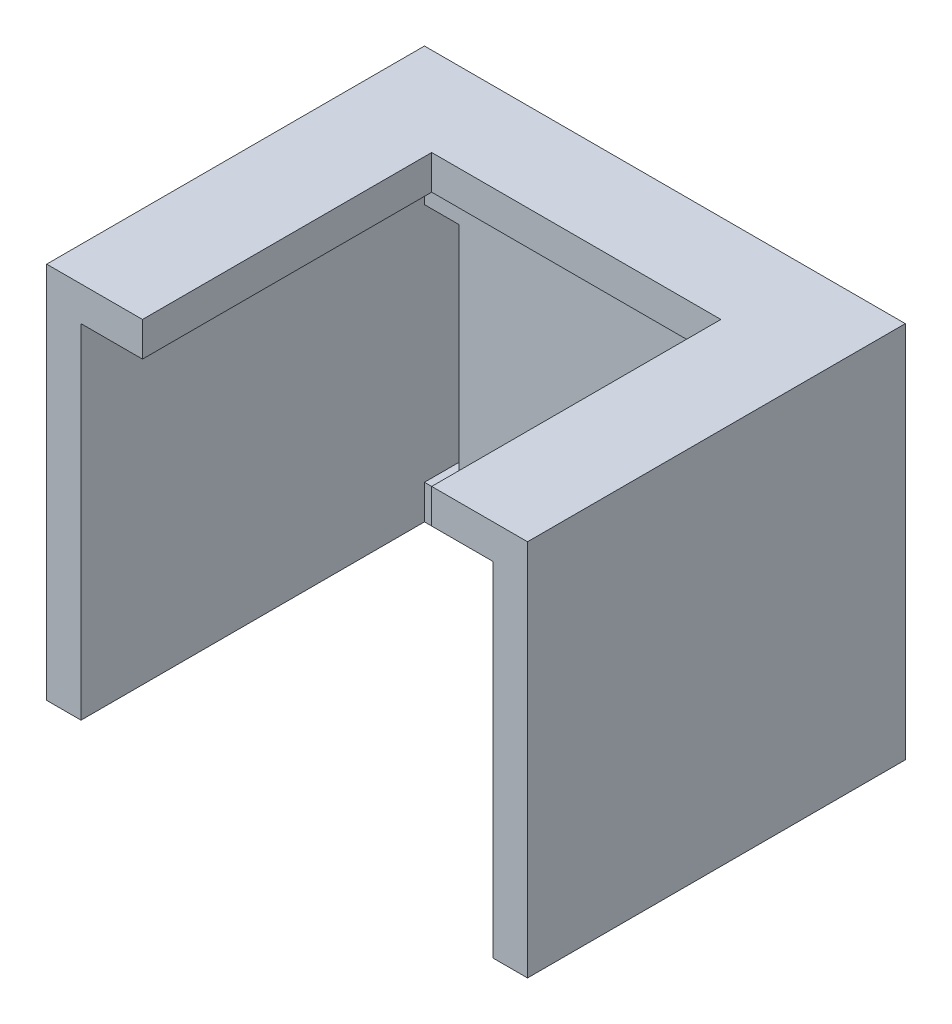
ISO-10303-21;
HEADER;
FILE_DESCRIPTION(('STEP AP214'),'2;1');
FILE_NAME('part.step','',(''),(''),'','','');
FILE_SCHEMA(('AUTOMOTIVE_DESIGN { 1 0 10303 214 1 1 1 1 }'));
ENDSEC;
DATA;
#1=APPLICATION_CONTEXT('core data for automotive mechanical design processes');
#2=APPLICATION_PROTOCOL_DEFINITION('international standard','automotive_design',2000,#1);
#3=PRODUCT_CONTEXT('',#1,'mechanical');
#4=PRODUCT('Part','Part','',(#3));
#5=PRODUCT_RELATED_PRODUCT_CATEGORY('part','',(#4));
#6=PRODUCT_DEFINITION_FORMATION('','',#4);
#7=PRODUCT_DEFINITION_CONTEXT('part definition',#1,'design');
#8=PRODUCT_DEFINITION('design','',#6,#7);
#9=PRODUCT_DEFINITION_SHAPE('','',#8);
#10=(LENGTH_UNIT() NAMED_UNIT(*) SI_UNIT(.MILLI.,.METRE.));
#11=(NAMED_UNIT(*) PLANE_ANGLE_UNIT() SI_UNIT($,.RADIAN.));
#12=(NAMED_UNIT(*) SI_UNIT($,.STERADIAN.) SOLID_ANGLE_UNIT());
#13=UNCERTAINTY_MEASURE_WITH_UNIT(LENGTH_MEASURE(1.E-05),#10,'distance_accuracy_value','');
#14=(GEOMETRIC_REPRESENTATION_CONTEXT(3) GLOBAL_UNCERTAINTY_ASSIGNED_CONTEXT((#13)) GLOBAL_UNIT_ASSIGNED_CONTEXT((#10,
#11,#12)) REPRESENTATION_CONTEXT('',''));
#15=CARTESIAN_POINT('',(0.,0.,0.));
#16=DIRECTION('',(0.,0.,1.));
#17=DIRECTION('',(1.,0.,0.));
#18=AXIS2_PLACEMENT_3D('',#15,#16,#17);
#19=CARTESIAN_POINT('',(-65.,50.,0.));
#20=DIRECTION('',(0.,1.,0.));
#21=DIRECTION('',(0.,0.,1.));
#22=AXIS2_PLACEMENT_3D('',#19,#20,#21);
#23=PLANE('',#22);
#24=DIRECTION('',(1.,0.,0.));
#25=VECTOR('',#24,1.);
#26=CARTESIAN_POINT('',(-5.,50.,5.));
#27=LINE('',#26,#25);
#28=CARTESIAN_POINT('',(-65.,50.,5.));
#29=VERTEX_POINT('',#28);
#30=CARTESIAN_POINT('',(-5.01959186529889,50.,5.));
#31=VERTEX_POINT('',#30);
#32=EDGE_CURVE('E42',#29,#31,#27,.T.);
#33=ORIENTED_EDGE('',*,*,#32,.T.);
#34=DIRECTION('',(0.,0.,1.));
#35=VECTOR('',#34,1.);
#36=CARTESIAN_POINT('',(-5.01959186529888,50.,0.));
#37=LINE('',#36,#35);
#38=CARTESIAN_POINT('',(-5.01959186529888,50.,0.));
#39=VERTEX_POINT('',#38);
#40=EDGE_CURVE('E53',#39,#31,#37,.T.);
#41=ORIENTED_EDGE('',*,*,#40,.F.);
#42=DIRECTION('',(-1.,0.,0.));
#43=VECTOR('',#42,1.);
#44=CARTESIAN_POINT('',(-10.0195918652989,50.,0.));
#45=LINE('',#44,#43);
#46=CARTESIAN_POINT('',(-5.,50.,0.));
#47=VERTEX_POINT('',#46);
#48=EDGE_CURVE('E306',#47,#39,#45,.T.);
#49=ORIENTED_EDGE('',*,*,#48,.F.);
#50=DIRECTION('',(0.,0.,1.));
#51=VECTOR('',#50,1.);
#52=CARTESIAN_POINT('',(-5.,50.,0.));
#53=LINE('',#52,#51);
#54=CARTESIAN_POINT('',(-5.,50.,55.));
#55=VERTEX_POINT('',#54);
#56=EDGE_CURVE('E288',#47,#55,#53,.T.);
#57=ORIENTED_EDGE('',*,*,#56,.T.);
#58=DIRECTION('',(1.,0.,0.));
#59=VECTOR('',#58,1.);
#60=CARTESIAN_POINT('',(-5.,50.,55.));
#61=LINE('',#60,#59);
#62=CARTESIAN_POINT('',(-13.95,50.,55.));
#63=VERTEX_POINT('',#62);
#64=EDGE_CURVE('E252',#63,#55,#61,.T.);
#65=ORIENTED_EDGE('',*,*,#64,.F.);
#66=DIRECTION('',(0.,0.,-1.));
#67=VECTOR('',#66,1.);
#68=CARTESIAN_POINT('',(-13.95,50.,55.));
#69=LINE('',#68,#67);
#70=CARTESIAN_POINT('',(-13.95,50.,12.9));
#71=VERTEX_POINT('',#70);
#72=EDGE_CURVE('E221',#63,#71,#69,.T.);
#73=ORIENTED_EDGE('',*,*,#72,.T.);
#74=DIRECTION('',(-1.,0.,0.));
#75=VECTOR('',#74,1.);
#76=CARTESIAN_POINT('',(-56.05,50.,12.9));
#77=LINE('',#76,#75);
#78=CARTESIAN_POINT('',(-56.05,50.,12.9));
#79=VERTEX_POINT('',#78);
#80=EDGE_CURVE('E225',#71,#79,#77,.T.);
#81=ORIENTED_EDGE('',*,*,#80,.T.);
#82=DIRECTION('',(0.,0.,1.));
#83=VECTOR('',#82,1.);
#84=CARTESIAN_POINT('',(-56.05,50.,55.));
#85=LINE('',#84,#83);
#86=CARTESIAN_POINT('',(-56.05,50.,55.));
#87=VERTEX_POINT('',#86);
#88=EDGE_CURVE('E218',#79,#87,#85,.T.);
#89=ORIENTED_EDGE('',*,*,#88,.T.);
#90=CARTESIAN_POINT('',(-65.,50.,55.));
#91=VERTEX_POINT('',#90);
#92=EDGE_CURVE('E253',#91,#87,#61,.T.);
#93=ORIENTED_EDGE('',*,*,#92,.F.);
#94=DIRECTION('',(0.,0.,1.));
#95=VECTOR('',#94,1.);
#96=CARTESIAN_POINT('',(-65.,50.,0.));
#97=LINE('',#96,#95);
#98=EDGE_CURVE('E290',#29,#91,#97,.T.);
#99=ORIENTED_EDGE('',*,*,#98,.F.);
#100=EDGE_LOOP('',(#33,#41,#49,#57,#65,#73,#81,#89,#93,#99));
#101=FACE_BOUND('',#100,.T.);
#102=ADVANCED_FACE('F33',(#101),#23,.F.);
#103=CARTESIAN_POINT('',(-10.0195918652989,50.,0.));
#104=DIRECTION('',(-1.,0.,0.));
#105=DIRECTION('',(0.,-1.,0.));
#106=AXIS2_PLACEMENT_3D('',#103,#104,#105);
#107=PLANE('',#106);
#108=DIRECTION('',(0.,0.,-1.));
#109=VECTOR('',#108,1.);
#110=CARTESIAN_POINT('',(-10.0195918652989,40.,0.));
#111=LINE('',#110,#109);
#112=CARTESIAN_POINT('',(-10.0195918652989,40.,5.));
#113=VERTEX_POINT('',#112);
#114=CARTESIAN_POINT('',(-10.0195918652989,40.,0.));
#115=VERTEX_POINT('',#114);
#116=EDGE_CURVE('E201',#113,#115,#111,.T.);
#117=ORIENTED_EDGE('',*,*,#116,.F.);
#118=DIRECTION('',(0.,-1.,0.));
#119=VECTOR('',#118,1.);
#120=CARTESIAN_POINT('',(-10.0195918652989,50.,5.));
#121=LINE('',#120,#119);
#122=CARTESIAN_POINT('',(-10.0195918652989,5.,5.));
#123=VERTEX_POINT('',#122);
#124=EDGE_CURVE('E188',#113,#123,#121,.T.);
#125=ORIENTED_EDGE('',*,*,#124,.T.);
#126=DIRECTION('',(0.,0.,1.));
#127=VECTOR('',#126,1.);
#128=CARTESIAN_POINT('',(-10.0195918652989,5.,0.));
#129=LINE('',#128,#127);
#130=CARTESIAN_POINT('',(-10.0195918652989,5.,0.));
#131=VERTEX_POINT('',#130);
#132=EDGE_CURVE('E308',#131,#123,#129,.T.);
#133=ORIENTED_EDGE('',*,*,#132,.F.);
#134=DIRECTION('',(0.,-1.,0.));
#135=VECTOR('',#134,1.);
#136=CARTESIAN_POINT('',(-10.0195918652989,50.,0.));
#137=LINE('',#136,#135);
#138=EDGE_CURVE('E297',#115,#131,#137,.T.);
#139=ORIENTED_EDGE('',*,*,#138,.F.);
#140=EDGE_LOOP('',(#117,#125,#133,#139));
#141=FACE_BOUND('',#140,.T.);
#142=ADVANCED_FACE('F414',(#141),#107,.F.);
#143=CARTESIAN_POINT('',(-65.,50.,0.));
#144=DIRECTION('',(-1.,0.,0.));
#145=DIRECTION('',(0.,0.,1.));
#146=AXIS2_PLACEMENT_3D('',#143,#144,#145);
#147=PLANE('',#146);
#148=DIRECTION('',(0.,0.,1.));
#149=VECTOR('',#148,1.);
#150=CARTESIAN_POINT('',(-65.,40.,0.));
#151=LINE('',#150,#149);
#152=CARTESIAN_POINT('',(-65.,40.,0.));
#153=VERTEX_POINT('',#152);
#154=CARTESIAN_POINT('',(-65.,40.,5.));
#155=VERTEX_POINT('',#154);
#156=EDGE_CURVE('E204',#153,#155,#151,.T.);
#157=ORIENTED_EDGE('',*,*,#156,.T.);
#158=DIRECTION('',(0.,1.,0.));
#159=VECTOR('',#158,1.);
#160=CARTESIAN_POINT('',(-65.,50.,5.));
#161=LINE('',#160,#159);
#162=EDGE_CURVE('E206',#155,#29,#161,.T.);
#163=ORIENTED_EDGE('',*,*,#162,.T.);
#164=ORIENTED_EDGE('',*,*,#98,.T.);
#165=DIRECTION('',(0.,1.,0.));
#166=VECTOR('',#165,1.);
#167=CARTESIAN_POINT('',(-65.,0.,55.));
#168=LINE('',#167,#166);
#169=CARTESIAN_POINT('',(-65.,0.,55.));
#170=VERTEX_POINT('',#169);
#171=EDGE_CURVE('E249',#170,#91,#168,.T.);
#172=ORIENTED_EDGE('',*,*,#171,.F.);
#173=DIRECTION('',(0.,0.,-1.));
#174=VECTOR('',#173,1.);
#175=CARTESIAN_POINT('',(-65.,0.,55.));
#176=LINE('',#175,#174);
#177=CARTESIAN_POINT('',(-65.,0.,5.));
#178=VERTEX_POINT('',#177);
#179=EDGE_CURVE('E273',#170,#178,#176,.T.);
#180=ORIENTED_EDGE('',*,*,#179,.T.);
#181=DIRECTION('',(0.,1.,0.));
#182=VECTOR('',#181,1.);
#183=CARTESIAN_POINT('',(-65.,0.,5.));
#184=LINE('',#183,#182);
#185=CARTESIAN_POINT('',(-65.,5.,5.));
#186=VERTEX_POINT('',#185);
#187=EDGE_CURVE('E237',#178,#186,#184,.T.);
#188=ORIENTED_EDGE('',*,*,#187,.T.);
#189=DIRECTION('',(0.,0.,1.));
#190=VECTOR('',#189,1.);
#191=CARTESIAN_POINT('',(-65.,5.,0.));
#192=LINE('',#191,#190);
#193=CARTESIAN_POINT('',(-65.,5.,0.));
#194=VERTEX_POINT('',#193);
#195=EDGE_CURVE('E284',#194,#186,#192,.T.);
#196=ORIENTED_EDGE('',*,*,#195,.F.);
#197=DIRECTION('',(0.,-1.,0.));
#198=VECTOR('',#197,1.);
#199=CARTESIAN_POINT('',(-65.,50.,0.));
#200=LINE('',#199,#198);
#201=EDGE_CURVE('E275',#153,#194,#200,.T.);
#202=ORIENTED_EDGE('',*,*,#201,.F.);
#203=EDGE_LOOP('',(#157,#163,#164,#172,#180,#188,#196,#202));
#204=FACE_BOUND('',#203,.T.);
#205=ADVANCED_FACE('F385',(#204),#147,.F.);
#206=CARTESIAN_POINT('',(-60.,50.,0.));
#207=DIRECTION('',(1.,0.,0.));
#208=DIRECTION('',(0.,1.,0.));
#209=AXIS2_PLACEMENT_3D('',#206,#207,#208);
#210=PLANE('',#209);
#211=DIRECTION('',(0.,0.,1.));
#212=VECTOR('',#211,1.);
#213=CARTESIAN_POINT('',(-60.,40.,0.));
#214=LINE('',#213,#212);
#215=CARTESIAN_POINT('',(-60.,40.,0.));
#216=VERTEX_POINT('',#215);
#217=CARTESIAN_POINT('',(-60.,40.,5.));
#218=VERTEX_POINT('',#217);
#219=EDGE_CURVE('E191',#216,#218,#214,.T.);
#220=ORIENTED_EDGE('',*,*,#219,.F.);
#221=DIRECTION('',(0.,1.,0.));
#222=VECTOR('',#221,1.);
#223=CARTESIAN_POINT('',(-60.,50.,0.));
#224=LINE('',#223,#222);
#225=CARTESIAN_POINT('',(-60.,5.,0.));
#226=VERTEX_POINT('',#225);
#227=EDGE_CURVE('E281',#226,#216,#224,.T.);
#228=ORIENTED_EDGE('',*,*,#227,.F.);
#229=DIRECTION('',(0.,0.,1.));
#230=VECTOR('',#229,1.);
#231=CARTESIAN_POINT('',(-60.,5.,0.));
#232=LINE('',#231,#230);
#233=CARTESIAN_POINT('',(-60.,5.,5.));
#234=VERTEX_POINT('',#233);
#235=EDGE_CURVE('E293',#226,#234,#232,.T.);
#236=ORIENTED_EDGE('',*,*,#235,.T.);
#237=DIRECTION('',(0.,1.,0.));
#238=VECTOR('',#237,1.);
#239=CARTESIAN_POINT('',(-60.,50.,5.));
#240=LINE('',#239,#238);
#241=EDGE_CURVE('E278',#234,#218,#240,.T.);
#242=ORIENTED_EDGE('',*,*,#241,.T.);
#243=EDGE_LOOP('',(#220,#228,#236,#242));
#244=FACE_BOUND('',#243,.T.);
#245=ADVANCED_FACE('F425',(#244),#210,.F.);
#246=CARTESIAN_POINT('',(0.,0.,55.));
#247=DIRECTION('',(0.,0.,-1.));
#248=DIRECTION('',(-1.,0.,0.));
#249=AXIS2_PLACEMENT_3D('',#246,#247,#248);
#250=PLANE('',#249);
#251=ORIENTED_EDGE('',*,*,#92,.T.);
#252=DIRECTION('',(0.,1.,0.));
#253=VECTOR('',#252,1.);
#254=CARTESIAN_POINT('',(-56.05,50.,55.));
#255=LINE('',#254,#253);
#256=CARTESIAN_POINT('',(-56.05,55.,55.));
#257=VERTEX_POINT('',#256);
#258=EDGE_CURVE('E228',#87,#257,#255,.T.);
#259=ORIENTED_EDGE('',*,*,#258,.T.);
#260=DIRECTION('',(-1.,0.,0.));
#261=VECTOR('',#260,1.);
#262=CARTESIAN_POINT('',(0.,55.,55.));
#263=LINE('',#262,#261);
#264=CARTESIAN_POINT('',(-70.,55.,55.));
#265=VERTEX_POINT('',#264);
#266=EDGE_CURVE('E264',#257,#265,#263,.T.);
#267=ORIENTED_EDGE('',*,*,#266,.T.);
#268=DIRECTION('',(0.,-1.,0.));
#269=VECTOR('',#268,1.);
#270=CARTESIAN_POINT('',(-70.,0.,55.));
#271=LINE('',#270,#269);
#272=CARTESIAN_POINT('',(-70.,0.,55.));
#273=VERTEX_POINT('',#272);
#274=EDGE_CURVE('E244',#265,#273,#271,.T.);
#275=ORIENTED_EDGE('',*,*,#274,.T.);
#276=DIRECTION('',(1.,0.,0.));
#277=VECTOR('',#276,1.);
#278=CARTESIAN_POINT('',(-70.,0.,55.));
#279=LINE('',#278,#277);
#280=EDGE_CURVE('E247',#273,#170,#279,.T.);
#281=ORIENTED_EDGE('',*,*,#280,.T.);
#282=ORIENTED_EDGE('',*,*,#171,.T.);
#283=EDGE_LOOP('',(#251,#259,#267,#275,#281,#282));
#284=FACE_BOUND('',#283,.T.);
#285=ADVANCED_FACE('F361',(#284),#250,.F.);
#286=CARTESIAN_POINT('',(0.,0.,5.));
#287=DIRECTION('',(-1.,0.,0.));
#288=DIRECTION('',(0.,-1.,0.));
#289=AXIS2_PLACEMENT_3D('',#286,#287,#288);
#290=PLANE('',#289);
#291=DIRECTION('',(0.,1.,0.));
#292=VECTOR('',#291,1.);
#293=CARTESIAN_POINT('',(0.,0.,0.));
#294=LINE('',#293,#292);
#295=CARTESIAN_POINT('',(0.,0.,0.));
#296=VERTEX_POINT('',#295);
#297=CARTESIAN_POINT('',(0.,55.,0.));
#298=VERTEX_POINT('',#297);
#299=EDGE_CURVE('E292',#296,#298,#294,.T.);
#300=ORIENTED_EDGE('',*,*,#299,.T.);
#301=DIRECTION('',(0.,0.,-1.));
#302=VECTOR('',#301,1.);
#303=CARTESIAN_POINT('',(0.,55.,5.));
#304=LINE('',#303,#302);
#305=CARTESIAN_POINT('',(0.,55.,55.));
#306=VERTEX_POINT('',#305);
#307=EDGE_CURVE('E37',#306,#298,#304,.T.);
#308=ORIENTED_EDGE('',*,*,#307,.F.);
#309=DIRECTION('',(0.,1.,0.));
#310=VECTOR('',#309,1.);
#311=CARTESIAN_POINT('',(0.,0.,55.));
#312=LINE('',#311,#310);
#313=CARTESIAN_POINT('',(0.,0.,55.));
#314=VERTEX_POINT('',#313);
#315=EDGE_CURVE('E261',#314,#306,#312,.T.);
#316=ORIENTED_EDGE('',*,*,#315,.F.);
#317=DIRECTION('',(0.,0.,-1.));
#318=VECTOR('',#317,1.);
#319=CARTESIAN_POINT('',(0.,0.,5.));
#320=LINE('',#319,#318);
#321=EDGE_CURVE('E322',#314,#296,#320,.T.);
#322=ORIENTED_EDGE('',*,*,#321,.T.);
#323=EDGE_LOOP('',(#300,#308,#316,#322));
#324=FACE_BOUND('',#323,.T.);
#325=ADVANCED_FACE('F35',(#324),#290,.F.);
#326=CARTESIAN_POINT('',(0.,55.,5.));
#327=DIRECTION('',(0.,-1.,0.));
#328=DIRECTION('',(1.,0.,0.));
#329=AXIS2_PLACEMENT_3D('',#326,#327,#328);
#330=PLANE('',#329);
#331=ORIENTED_EDGE('',*,*,#266,.F.);
#332=DIRECTION('',(0.,0.,1.));
#333=VECTOR('',#332,1.);
#334=CARTESIAN_POINT('',(-56.05,55.,55.));
#335=LINE('',#334,#333);
#336=CARTESIAN_POINT('',(-56.05,55.,12.9));
#337=VERTEX_POINT('',#336);
#338=EDGE_CURVE('E217',#337,#257,#335,.T.);
#339=ORIENTED_EDGE('',*,*,#338,.F.);
#340=DIRECTION('',(-1.,0.,0.));
#341=VECTOR('',#340,1.);
#342=CARTESIAN_POINT('',(-56.05,55.,12.9));
#343=LINE('',#342,#341);
#344=CARTESIAN_POINT('',(-13.95,55.,12.9));
#345=VERTEX_POINT('',#344);
#346=EDGE_CURVE('E222',#345,#337,#343,.T.);
#347=ORIENTED_EDGE('',*,*,#346,.F.);
#348=DIRECTION('',(0.,0.,-1.));
#349=VECTOR('',#348,1.);
#350=CARTESIAN_POINT('',(-13.95,55.,55.));
#351=LINE('',#350,#349);
#352=CARTESIAN_POINT('',(-13.95,55.,55.));
#353=VERTEX_POINT('',#352);
#354=EDGE_CURVE('E230',#353,#345,#351,.T.);
#355=ORIENTED_EDGE('',*,*,#354,.F.);
#356=EDGE_CURVE('E265',#306,#353,#263,.T.);
#357=ORIENTED_EDGE('',*,*,#356,.F.);
#358=ORIENTED_EDGE('',*,*,#307,.T.);
#359=DIRECTION('',(-1.,0.,0.));
#360=VECTOR('',#359,1.);
#361=CARTESIAN_POINT('',(0.,55.,0.));
#362=LINE('',#361,#360);
#363=CARTESIAN_POINT('',(-70.,55.,0.));
#364=VERTEX_POINT('',#363);
#365=EDGE_CURVE('E326',#298,#364,#362,.T.);
#366=ORIENTED_EDGE('',*,*,#365,.T.);
#367=DIRECTION('',(0.,0.,-1.));
#368=VECTOR('',#367,1.);
#369=CARTESIAN_POINT('',(-70.,55.,5.));
#370=LINE('',#369,#368);
#371=EDGE_CURVE('E335',#265,#364,#370,.T.);
#372=ORIENTED_EDGE('',*,*,#371,.F.);
#373=EDGE_LOOP('',(#331,#339,#347,#355,#357,#358,#366,#372));
#374=FACE_BOUND('',#373,.T.);
#375=ADVANCED_FACE('F345',(#374),#330,.F.);
#376=CARTESIAN_POINT('',(-70.,0.,5.));
#377=DIRECTION('',(1.,0.,0.));
#378=DIRECTION('',(0.,0.,-1.));
#379=AXIS2_PLACEMENT_3D('',#376,#377,#378);
#380=PLANE('',#379);
#381=DIRECTION('',(0.,-1.,0.));
#382=VECTOR('',#381,1.);
#383=CARTESIAN_POINT('',(-70.,0.,0.));
#384=LINE('',#383,#382);
#385=CARTESIAN_POINT('',(-70.,0.,0.));
#386=VERTEX_POINT('',#385);
#387=EDGE_CURVE('E328',#364,#386,#384,.T.);
#388=ORIENTED_EDGE('',*,*,#387,.T.);
#389=DIRECTION('',(0.,0.,-1.));
#390=VECTOR('',#389,1.);
#391=CARTESIAN_POINT('',(-70.,0.,5.));
#392=LINE('',#391,#390);
#393=EDGE_CURVE('E333',#273,#386,#392,.T.);
#394=ORIENTED_EDGE('',*,*,#393,.F.);
#395=ORIENTED_EDGE('',*,*,#274,.F.);
#396=ORIENTED_EDGE('',*,*,#371,.T.);
#397=EDGE_LOOP('',(#388,#394,#395,#396));
#398=FACE_BOUND('',#397,.T.);
#399=ADVANCED_FACE('F353',(#398),#380,.F.);
#400=CARTESIAN_POINT('',(0.,0.,5.));
#401=DIRECTION('',(0.,1.,0.));
#402=DIRECTION('',(0.,0.,1.));
#403=AXIS2_PLACEMENT_3D('',#400,#401,#402);
#404=PLANE('',#403);
#405=DIRECTION('',(1.,0.,0.));
#406=VECTOR('',#405,1.);
#407=CARTESIAN_POINT('',(0.,0.,0.));
#408=LINE('',#407,#406);
#409=EDGE_CURVE('E323',#386,#296,#408,.T.);
#410=ORIENTED_EDGE('',*,*,#409,.T.);
#411=ORIENTED_EDGE('',*,*,#321,.F.);
#412=DIRECTION('',(1.,0.,0.));
#413=VECTOR('',#412,1.);
#414=CARTESIAN_POINT('',(0.,0.,55.));
#415=LINE('',#414,#413);
#416=CARTESIAN_POINT('',(-5.,0.,55.));
#417=VERTEX_POINT('',#416);
#418=EDGE_CURVE('E258',#417,#314,#415,.T.);
#419=ORIENTED_EDGE('',*,*,#418,.F.);
#420=DIRECTION('',(0.,0.,-1.));
#421=VECTOR('',#420,1.);
#422=CARTESIAN_POINT('',(-5.,0.,55.));
#423=LINE('',#422,#421);
#424=CARTESIAN_POINT('',(-5.,0.,5.));
#425=VERTEX_POINT('',#424);
#426=EDGE_CURVE('E268',#417,#425,#423,.T.);
#427=ORIENTED_EDGE('',*,*,#426,.T.);
#428=DIRECTION('',(1.,0.,0.));
#429=VECTOR('',#428,1.);
#430=CARTESIAN_POINT('',(0.,0.,5.));
#431=LINE('',#430,#429);
#432=EDGE_CURVE('E319',#178,#425,#431,.T.);
#433=ORIENTED_EDGE('',*,*,#432,.F.);
#434=ORIENTED_EDGE('',*,*,#179,.F.);
#435=ORIENTED_EDGE('',*,*,#280,.F.);
#436=ORIENTED_EDGE('',*,*,#393,.T.);
#437=EDGE_LOOP('',(#410,#411,#419,#427,#433,#434,#435,#436));
#438=FACE_BOUND('',#437,.T.);
#439=ADVANCED_FACE('F356',(#438),#404,.F.);
#440=CARTESIAN_POINT('',(0.,0.,5.));
#441=DIRECTION('',(0.,0.,1.));
#442=DIRECTION('',(1.,0.,0.));
#443=AXIS2_PLACEMENT_3D('',#440,#441,#442);
#444=PLANE('',#443);
#445=DIRECTION('',(0.,-1.,0.));
#446=VECTOR('',#445,1.);
#447=CARTESIAN_POINT('',(-5.,0.,5.));
#448=LINE('',#447,#446);
#449=CARTESIAN_POINT('',(-5.,5.,5.));
#450=VERTEX_POINT('',#449);
#451=EDGE_CURVE('E11',#450,#425,#448,.T.);
#452=ORIENTED_EDGE('',*,*,#451,.F.);
#453=DIRECTION('',(1.,0.,0.));
#454=VECTOR('',#453,1.);
#455=CARTESIAN_POINT('',(-10.0195918652989,5.,5.));
#456=LINE('',#455,#454);
#457=EDGE_CURVE('E300',#123,#450,#456,.T.);
#458=ORIENTED_EDGE('',*,*,#457,.F.);
#459=ORIENTED_EDGE('',*,*,#124,.F.);
#460=DIRECTION('',(-1.,0.,0.));
#461=VECTOR('',#460,1.);
#462=CARTESIAN_POINT('',(-5.01959186529888,40.,5.));
#463=LINE('',#462,#461);
#464=CARTESIAN_POINT('',(-5.01959186529888,40.,5.));
#465=VERTEX_POINT('',#464);
#466=EDGE_CURVE('E185',#465,#113,#463,.T.);
#467=ORIENTED_EDGE('',*,*,#466,.F.);
#468=DIRECTION('',(0.,-1.,0.));
#469=VECTOR('',#468,1.);
#470=CARTESIAN_POINT('',(-5.01959186529888,50.,5.));
#471=LINE('',#470,#469);
#472=EDGE_CURVE('E174',#31,#465,#471,.T.);
#473=ORIENTED_EDGE('',*,*,#472,.F.);
#474=ORIENTED_EDGE('',*,*,#32,.F.);
#475=ORIENTED_EDGE('',*,*,#162,.F.);
#476=DIRECTION('',(1.,0.,0.));
#477=VECTOR('',#476,1.);
#478=CARTESIAN_POINT('',(-65.,40.,5.));
#479=LINE('',#478,#477);
#480=EDGE_CURVE('E209',#155,#218,#479,.T.);
#481=ORIENTED_EDGE('',*,*,#480,.T.);
#482=ORIENTED_EDGE('',*,*,#241,.F.);
#483=DIRECTION('',(1.,0.,0.));
#484=VECTOR('',#483,1.);
#485=CARTESIAN_POINT('',(-65.,5.,5.));
#486=LINE('',#485,#484);
#487=EDGE_CURVE('E285',#186,#234,#486,.T.);
#488=ORIENTED_EDGE('',*,*,#487,.F.);
#489=ORIENTED_EDGE('',*,*,#187,.F.);
#490=ORIENTED_EDGE('',*,*,#432,.T.);
#491=EDGE_LOOP('',(#452,#458,#459,#467,#473,#474,#475,#481,#482,#488,#489,#490));
#492=FACE_BOUND('',#491,.T.);
#493=ADVANCED_FACE('F186',(#492),#444,.T.);
#494=CARTESIAN_POINT('',(0.,0.,0.));
#495=DIRECTION('',(0.,0.,1.));
#496=DIRECTION('',(1.,0.,0.));
#497=AXIS2_PLACEMENT_3D('',#494,#495,#496);
#498=PLANE('',#497);
#499=DIRECTION('',(1.,0.,0.));
#500=VECTOR('',#499,1.);
#501=CARTESIAN_POINT('',(-65.,40.,0.));
#502=LINE('',#501,#500);
#503=EDGE_CURVE('E214',#153,#216,#502,.T.);
#504=ORIENTED_EDGE('',*,*,#503,.F.);
#505=ORIENTED_EDGE('',*,*,#201,.T.);
#506=DIRECTION('',(1.,0.,0.));
#507=VECTOR('',#506,1.);
#508=CARTESIAN_POINT('',(-65.,5.,0.));
#509=LINE('',#508,#507);
#510=EDGE_CURVE('E277',#194,#226,#509,.T.);
#511=ORIENTED_EDGE('',*,*,#510,.T.);
#512=ORIENTED_EDGE('',*,*,#227,.T.);
#513=EDGE_LOOP('',(#504,#505,#511,#512));
#514=FACE_BOUND('',#513,.T.);
#515=ORIENTED_EDGE('',*,*,#48,.T.);
#516=DIRECTION('',(0.,1.,0.));
#517=VECTOR('',#516,1.);
#518=CARTESIAN_POINT('',(-5.01959186529888,50.,0.));
#519=LINE('',#518,#517);
#520=CARTESIAN_POINT('',(-5.01959186529888,40.,0.));
#521=VERTEX_POINT('',#520);
#522=EDGE_CURVE('E202',#521,#39,#519,.T.);
#523=ORIENTED_EDGE('',*,*,#522,.F.);
#524=DIRECTION('',(-1.,0.,0.));
#525=VECTOR('',#524,1.);
#526=CARTESIAN_POINT('',(-5.01959186529888,40.,0.));
#527=LINE('',#526,#525);
#528=EDGE_CURVE('E192',#521,#115,#527,.T.);
#529=ORIENTED_EDGE('',*,*,#528,.T.);
#530=ORIENTED_EDGE('',*,*,#138,.T.);
#531=DIRECTION('',(1.,0.,0.));
#532=VECTOR('',#531,1.);
#533=CARTESIAN_POINT('',(-10.0195918652989,5.,0.));
#534=LINE('',#533,#532);
#535=CARTESIAN_POINT('',(-4.99999999999999,5.,0.));
#536=VERTEX_POINT('',#535);
#537=EDGE_CURVE('E299',#131,#536,#534,.T.);
#538=ORIENTED_EDGE('',*,*,#537,.T.);
#539=DIRECTION('',(0.,1.,0.));
#540=VECTOR('',#539,1.);
#541=CARTESIAN_POINT('',(-5.,50.,0.));
#542=LINE('',#541,#540);
#543=EDGE_CURVE('E303',#536,#47,#542,.T.);
#544=ORIENTED_EDGE('',*,*,#543,.T.);
#545=EDGE_LOOP('',(#515,#523,#529,#530,#538,#544));
#546=FACE_BOUND('',#545,.T.);
#547=ORIENTED_EDGE('',*,*,#299,.F.);
#548=ORIENTED_EDGE('',*,*,#409,.F.);
#549=ORIENTED_EDGE('',*,*,#387,.F.);
#550=ORIENTED_EDGE('',*,*,#365,.F.);
#551=EDGE_LOOP('',(#547,#548,#549,#550));
#552=FACE_BOUND('',#551,.T.);
#553=ADVANCED_FACE('F352',(#514,#546,#552),#498,.F.);
#554=CARTESIAN_POINT('',(-5.,50.,0.));
#555=DIRECTION('',(1.,0.,0.));
#556=DIRECTION('',(0.,1.,0.));
#557=AXIS2_PLACEMENT_3D('',#554,#555,#556);
#558=PLANE('',#557);
#559=DIRECTION('',(0.,0.,1.));
#560=VECTOR('',#559,1.);
#561=CARTESIAN_POINT('',(-4.99999999999999,5.,0.));
#562=LINE('',#561,#560);
#563=EDGE_CURVE('E314',#536,#450,#562,.T.);
#564=ORIENTED_EDGE('',*,*,#563,.T.);
#565=ORIENTED_EDGE('',*,*,#451,.T.);
#566=ORIENTED_EDGE('',*,*,#426,.F.);
#567=DIRECTION('',(0.,-1.,0.));
#568=VECTOR('',#567,1.);
#569=CARTESIAN_POINT('',(-5.,0.,55.));
#570=LINE('',#569,#568);
#571=EDGE_CURVE('E256',#55,#417,#570,.T.);
#572=ORIENTED_EDGE('',*,*,#571,.F.);
#573=ORIENTED_EDGE('',*,*,#56,.F.);
#574=ORIENTED_EDGE('',*,*,#543,.F.);
#575=EDGE_LOOP('',(#564,#565,#566,#572,#573,#574));
#576=FACE_BOUND('',#575,.T.);
#577=ADVANCED_FACE('F399',(#576),#558,.F.);
#578=CARTESIAN_POINT('',(-10.0195918652989,5.,0.));
#579=DIRECTION('',(0.,-1.,0.));
#580=DIRECTION('',(0.,0.,-1.));
#581=AXIS2_PLACEMENT_3D('',#578,#579,#580);
#582=PLANE('',#581);
#583=ORIENTED_EDGE('',*,*,#457,.T.);
#584=ORIENTED_EDGE('',*,*,#563,.F.);
#585=ORIENTED_EDGE('',*,*,#537,.F.);
#586=ORIENTED_EDGE('',*,*,#132,.T.);
#587=EDGE_LOOP('',(#583,#584,#585,#586));
#588=FACE_BOUND('',#587,.T.);
#589=ADVANCED_FACE('F402',(#588),#582,.F.);
#590=CARTESIAN_POINT('',(-65.,5.,0.));
#591=DIRECTION('',(0.,-1.,0.));
#592=DIRECTION('',(0.,0.,-1.));
#593=AXIS2_PLACEMENT_3D('',#590,#591,#592);
#594=PLANE('',#593);
#595=ORIENTED_EDGE('',*,*,#487,.T.);
#596=ORIENTED_EDGE('',*,*,#235,.F.);
#597=ORIENTED_EDGE('',*,*,#510,.F.);
#598=ORIENTED_EDGE('',*,*,#195,.T.);
#599=EDGE_LOOP('',(#595,#596,#597,#598));
#600=FACE_BOUND('',#599,.T.);
#601=ADVANCED_FACE('F388',(#600),#594,.F.);
#602=ORIENTED_EDGE('',*,*,#356,.T.);
#603=DIRECTION('',(0.,1.,0.));
#604=VECTOR('',#603,1.);
#605=CARTESIAN_POINT('',(-13.95,50.,55.));
#606=LINE('',#605,#604);
#607=EDGE_CURVE('E240',#63,#353,#606,.T.);
#608=ORIENTED_EDGE('',*,*,#607,.F.);
#609=ORIENTED_EDGE('',*,*,#64,.T.);
#610=ORIENTED_EDGE('',*,*,#571,.T.);
#611=ORIENTED_EDGE('',*,*,#418,.T.);
#612=ORIENTED_EDGE('',*,*,#315,.T.);
#613=EDGE_LOOP('',(#602,#608,#609,#610,#611,#612));
#614=FACE_BOUND('',#613,.T.);
#615=ADVANCED_FACE('F374',(#614),#250,.F.);
#616=CARTESIAN_POINT('',(-56.05,50.,55.));
#617=DIRECTION('',(-1.,0.,0.));
#618=DIRECTION('',(0.,-1.,0.));
#619=AXIS2_PLACEMENT_3D('',#616,#617,#618);
#620=PLANE('',#619);
#621=ORIENTED_EDGE('',*,*,#338,.T.);
#622=ORIENTED_EDGE('',*,*,#258,.F.);
#623=ORIENTED_EDGE('',*,*,#88,.F.);
#624=DIRECTION('',(0.,1.,0.));
#625=VECTOR('',#624,1.);
#626=CARTESIAN_POINT('',(-56.05,50.,12.9));
#627=LINE('',#626,#625);
#628=EDGE_CURVE('E235',#79,#337,#627,.T.);
#629=ORIENTED_EDGE('',*,*,#628,.T.);
#630=EDGE_LOOP('',(#621,#622,#623,#629));
#631=FACE_BOUND('',#630,.T.);
#632=ADVANCED_FACE('F365',(#631),#620,.F.);
#633=CARTESIAN_POINT('',(-56.05,50.,12.9));
#634=DIRECTION('',(0.,0.,-1.));
#635=DIRECTION('',(-1.,0.,0.));
#636=AXIS2_PLACEMENT_3D('',#633,#634,#635);
#637=PLANE('',#636);
#638=ORIENTED_EDGE('',*,*,#346,.T.);
#639=ORIENTED_EDGE('',*,*,#628,.F.);
#640=ORIENTED_EDGE('',*,*,#80,.F.);
#641=DIRECTION('',(0.,1.,0.));
#642=VECTOR('',#641,1.);
#643=CARTESIAN_POINT('',(-13.95,50.,12.9));
#644=LINE('',#643,#642);
#645=EDGE_CURVE('E238',#71,#345,#644,.T.);
#646=ORIENTED_EDGE('',*,*,#645,.T.);
#647=EDGE_LOOP('',(#638,#639,#640,#646));
#648=FACE_BOUND('',#647,.T.);
#649=ADVANCED_FACE('F369',(#648),#637,.F.);
#650=CARTESIAN_POINT('',(-13.95,50.,55.));
#651=DIRECTION('',(1.,0.,0.));
#652=DIRECTION('',(0.,0.,-1.));
#653=AXIS2_PLACEMENT_3D('',#650,#651,#652);
#654=PLANE('',#653);
#655=ORIENTED_EDGE('',*,*,#354,.T.);
#656=ORIENTED_EDGE('',*,*,#645,.F.);
#657=ORIENTED_EDGE('',*,*,#72,.F.);
#658=ORIENTED_EDGE('',*,*,#607,.T.);
#659=EDGE_LOOP('',(#655,#656,#657,#658));
#660=FACE_BOUND('',#659,.T.);
#661=ADVANCED_FACE('F371',(#660),#654,.F.);
#662=CARTESIAN_POINT('',(-65.,40.,0.));
#663=DIRECTION('',(0.,1.,0.));
#664=DIRECTION('',(-1.,0.,0.));
#665=AXIS2_PLACEMENT_3D('',#662,#663,#664);
#666=PLANE('',#665);
#667=ORIENTED_EDGE('',*,*,#219,.T.);
#668=ORIENTED_EDGE('',*,*,#480,.F.);
#669=ORIENTED_EDGE('',*,*,#156,.F.);
#670=ORIENTED_EDGE('',*,*,#503,.T.);
#671=EDGE_LOOP('',(#667,#668,#669,#670));
#672=FACE_BOUND('',#671,.T.);
#673=ADVANCED_FACE('F396',(#672),#666,.F.);
#674=CARTESIAN_POINT('',(-5.01959186529888,40.,0.));
#675=DIRECTION('',(0.,1.,0.));
#676=DIRECTION('',(-1.,0.,0.));
#677=AXIS2_PLACEMENT_3D('',#674,#675,#676);
#678=PLANE('',#677);
#679=ORIENTED_EDGE('',*,*,#116,.T.);
#680=ORIENTED_EDGE('',*,*,#528,.F.);
#681=DIRECTION('',(0.,0.,-1.));
#682=VECTOR('',#681,1.);
#683=CARTESIAN_POINT('',(-5.01959186529888,40.,0.));
#684=LINE('',#683,#682);
#685=EDGE_CURVE('E179',#465,#521,#684,.T.);
#686=ORIENTED_EDGE('',*,*,#685,.F.);
#687=ORIENTED_EDGE('',*,*,#466,.T.);
#688=EDGE_LOOP('',(#679,#680,#686,#687));
#689=FACE_BOUND('',#688,.T.);
#690=ADVANCED_FACE('F194',(#689),#678,.F.);
#691=CARTESIAN_POINT('',(-5.01959186529887,0.,0.));
#692=DIRECTION('',(-1.,0.,0.));
#693=DIRECTION('',(0.,-1.,0.));
#694=AXIS2_PLACEMENT_3D('',#691,#692,#693);
#695=PLANE('',#694);
#696=ORIENTED_EDGE('',*,*,#522,.T.);
#697=ORIENTED_EDGE('',*,*,#40,.T.);
#698=ORIENTED_EDGE('',*,*,#472,.T.);
#699=ORIENTED_EDGE('',*,*,#685,.T.);
#700=EDGE_LOOP('',(#696,#697,#698,#699));
#701=FACE_BOUND('',#700,.T.);
#702=ADVANCED_FACE('F177',(#701),#695,.F.);
#703=CLOSED_SHELL('',(#102,#142,#205,#245,#285,#325,#375,#399,#439,#493,#553,#577,#589,#601,
#615,#632,#649,#661,#673,#690,#702));
#704=MANIFOLD_SOLID_BREP('B2',#703);
#705=ADVANCED_BREP_SHAPE_REPRESENTATION('',(#18,#704),#14);
#706=SHAPE_DEFINITION_REPRESENTATION(#9,#705);
ENDSEC;
END-ISO-10303-21;
